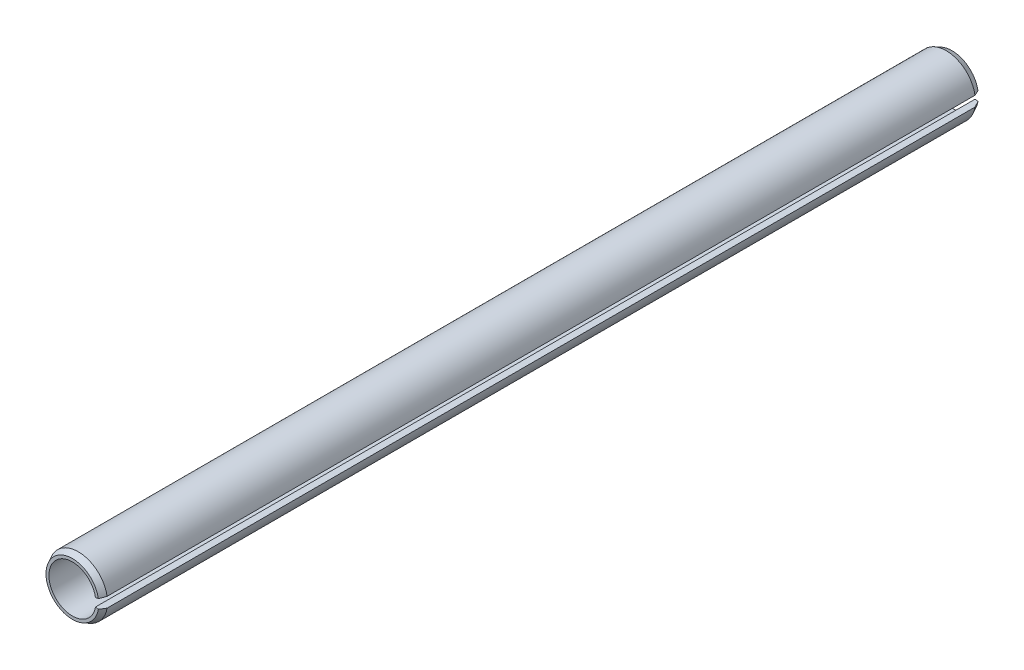
ISO-10303-21;
HEADER;
FILE_DESCRIPTION(('STEP AP214'),'2;1');
FILE_NAME('part.step','',(''),(''),'','','');
FILE_SCHEMA(('AUTOMOTIVE_DESIGN { 1 0 10303 214 1 1 1 1 }'));
ENDSEC;
DATA;
#1=APPLICATION_CONTEXT('core data for automotive mechanical design processes');
#2=APPLICATION_PROTOCOL_DEFINITION('international standard','automotive_design',2000,#1);
#3=PRODUCT_CONTEXT('',#1,'mechanical');
#4=PRODUCT('Part','Part','',(#3));
#5=PRODUCT_RELATED_PRODUCT_CATEGORY('part','',(#4));
#6=PRODUCT_DEFINITION_FORMATION('','',#4);
#7=PRODUCT_DEFINITION_CONTEXT('part definition',#1,'design');
#8=PRODUCT_DEFINITION('design','',#6,#7);
#9=PRODUCT_DEFINITION_SHAPE('','',#8);
#10=(LENGTH_UNIT() NAMED_UNIT(*) SI_UNIT(.MILLI.,.METRE.));
#11=(NAMED_UNIT(*) PLANE_ANGLE_UNIT() SI_UNIT($,.RADIAN.));
#12=(NAMED_UNIT(*) SI_UNIT($,.STERADIAN.) SOLID_ANGLE_UNIT());
#13=UNCERTAINTY_MEASURE_WITH_UNIT(LENGTH_MEASURE(1.E-05),#10,'distance_accuracy_value','');
#14=(GEOMETRIC_REPRESENTATION_CONTEXT(3) GLOBAL_UNCERTAINTY_ASSIGNED_CONTEXT((#13)) GLOBAL_UNIT_ASSIGNED_CONTEXT((#10,
#11,#12)) REPRESENTATION_CONTEXT('',''));
#15=CARTESIAN_POINT('',(0.,0.,0.));
#16=DIRECTION('',(0.,0.,1.));
#17=DIRECTION('',(1.,0.,0.));
#18=AXIS2_PLACEMENT_3D('',#15,#16,#17);
#19=CARTESIAN_POINT('',(0.,0.,-15.));
#20=DIRECTION('',(0.,0.,-1.));
#21=DIRECTION('',(-1.,0.,0.));
#22=AXIS2_PLACEMENT_3D('',#19,#20,#21);
#23=CYLINDRICAL_SURFACE('',#22,0.799999999999998);
#24=CARTESIAN_POINT('',(0.,0.,-15.));
#25=DIRECTION('',(0.,0.,-1.));
#26=DIRECTION('',(-1.,0.,0.));
#27=AXIS2_PLACEMENT_3D('',#24,#25,#26);
#28=CIRCLE('',#27,0.799999999999998);
#29=CARTESIAN_POINT('',(0.787846202409768,-0.138918542133538,-15.));
#30=VERTEX_POINT('',#29);
#31=CARTESIAN_POINT('',(0.787846202409768,0.138918542133539,-15.));
#32=VERTEX_POINT('',#31);
#33=EDGE_CURVE('E11',#30,#32,#28,.T.);
#34=ORIENTED_EDGE('',*,*,#33,.T.);
#35=DIRECTION('',(0.,0.,-1.));
#36=VECTOR('',#35,1.);
#37=CARTESIAN_POINT('',(0.787846202409768,0.138918542133539,15.));
#38=LINE('',#37,#36);
#39=CARTESIAN_POINT('',(0.787846202409768,0.138918542133539,15.));
#40=VERTEX_POINT('',#39);
#41=EDGE_CURVE('E84',#40,#32,#38,.T.);
#42=ORIENTED_EDGE('',*,*,#41,.F.);
#43=CARTESIAN_POINT('',(0.,0.,15.));
#44=DIRECTION('',(0.,0.,-1.));
#45=DIRECTION('',(-1.,0.,0.));
#46=AXIS2_PLACEMENT_3D('',#43,#44,#45);
#47=CIRCLE('',#46,0.799999999999998);
#48=CARTESIAN_POINT('',(0.787846202409768,-0.138918542133538,15.));
#49=VERTEX_POINT('',#48);
#50=EDGE_CURVE('E47',#49,#40,#47,.T.);
#51=ORIENTED_EDGE('',*,*,#50,.F.);
#52=DIRECTION('',(0.,0.,-1.));
#53=VECTOR('',#52,1.);
#54=CARTESIAN_POINT('',(0.787846202409768,-0.138918542133538,15.));
#55=LINE('',#54,#53);
#56=EDGE_CURVE('E86',#49,#30,#55,.T.);
#57=ORIENTED_EDGE('',*,*,#56,.T.);
#58=EDGE_LOOP('',(#34,#42,#51,#57));
#59=FACE_BOUND('',#58,.T.);
#60=ADVANCED_FACE('F32',(#59),#23,.F.);
#61=CARTESIAN_POINT('',(0.787846202409768,-0.138918542133538,-15.));
#62=DIRECTION('',(0.,0.,-1.));
#63=DIRECTION('',(-1.,0.,0.));
#64=AXIS2_PLACEMENT_3D('',#61,#62,#63);
#65=PLANE('',#64);
#66=CARTESIAN_POINT('',(0.,0.,-15.));
#67=DIRECTION('',(0.,0.,-1.));
#68=DIRECTION('',(-1.,0.,0.));
#69=AXIS2_PLACEMENT_3D('',#66,#67,#68);
#70=CIRCLE('',#69,0.899999999999998);
#71=CARTESIAN_POINT('',(0.886326977710989,-0.156283359900231,-15.));
#72=VERTEX_POINT('',#71);
#73=CARTESIAN_POINT('',(0.886326977710989,0.156283359900232,-15.));
#74=VERTEX_POINT('',#73);
#75=EDGE_CURVE('E40',#72,#74,#70,.T.);
#76=ORIENTED_EDGE('',*,*,#75,.T.);
#77=DIRECTION('',(0.984807753012209,0.173648177666924,0.));
#78=VECTOR('',#77,1.);
#79=CARTESIAN_POINT('',(0.787846202409768,0.138918542133539,-15.));
#80=LINE('',#79,#78);
#81=EDGE_CURVE('E95',#32,#74,#80,.T.);
#82=ORIENTED_EDGE('',*,*,#81,.F.);
#83=ORIENTED_EDGE('',*,*,#33,.F.);
#84=DIRECTION('',(0.984807753012209,-0.173648177666924,0.));
#85=VECTOR('',#84,1.);
#86=CARTESIAN_POINT('',(0.787846202409768,-0.138918542133538,-15.));
#87=LINE('',#86,#85);
#88=EDGE_CURVE('E111',#30,#72,#87,.T.);
#89=ORIENTED_EDGE('',*,*,#88,.T.);
#90=EDGE_LOOP('',(#76,#82,#83,#89));
#91=FACE_BOUND('',#90,.T.);
#92=ADVANCED_FACE('F34',(#91),#65,.T.);
#93=CARTESIAN_POINT('',(0.,0.,-15.));
#94=DIRECTION('',(0.,0.,1.));
#95=DIRECTION('',(1.,0.,0.));
#96=AXIS2_PLACEMENT_3D('',#93,#94,#95);
#97=CONICAL_SURFACE('',#96,0.899999999999998,0.463647609000805);
#98=CARTESIAN_POINT('',(0.,0.,-14.8));
#99=DIRECTION('',(0.,0.,-1.));
#100=DIRECTION('',(-1.,0.,0.));
#101=AXIS2_PLACEMENT_3D('',#98,#99,#100);
#102=CIRCLE('',#101,0.999999999999998);
#103=CARTESIAN_POINT('',(0.98480775301221,-0.173648177666923,-14.8));
#104=VERTEX_POINT('',#103);
#105=CARTESIAN_POINT('',(0.98480775301221,0.173648177666924,-14.8));
#106=VERTEX_POINT('',#105);
#107=EDGE_CURVE('E127',#104,#106,#102,.T.);
#108=ORIENTED_EDGE('',*,*,#107,.T.);
#109=DIRECTION('',(0.440419416100824,0.0776578258864405,0.894427190999916));
#110=VECTOR('',#109,1.);
#111=CARTESIAN_POINT('',(0.886326977710989,0.156283359900232,-15.));
#112=LINE('',#111,#110);
#113=EDGE_CURVE('E100',#74,#106,#112,.T.);
#114=ORIENTED_EDGE('',*,*,#113,.F.);
#115=ORIENTED_EDGE('',*,*,#75,.F.);
#116=DIRECTION('',(0.440419416100824,-0.0776578258864405,0.894427190999916));
#117=VECTOR('',#116,1.);
#118=CARTESIAN_POINT('',(0.886326977710989,-0.156283359900231,-15.));
#119=LINE('',#118,#117);
#120=EDGE_CURVE('E113',#72,#104,#119,.T.);
#121=ORIENTED_EDGE('',*,*,#120,.T.);
#122=EDGE_LOOP('',(#108,#114,#115,#121));
#123=FACE_BOUND('',#122,.T.);
#124=ADVANCED_FACE('F129',(#123),#97,.T.);
#125=CARTESIAN_POINT('',(0.,0.,-15.));
#126=DIRECTION('',(0.,0.,-1.));
#127=DIRECTION('',(-1.,0.,0.));
#128=AXIS2_PLACEMENT_3D('',#125,#126,#127);
#129=CYLINDRICAL_SURFACE('',#128,0.999999999999998);
#130=CARTESIAN_POINT('',(0.,0.,14.8));
#131=DIRECTION('',(0.,0.,-1.));
#132=DIRECTION('',(-1.,0.,0.));
#133=AXIS2_PLACEMENT_3D('',#130,#131,#132);
#134=CIRCLE('',#133,0.999999999999998);
#135=CARTESIAN_POINT('',(0.98480775301221,-0.173648177666923,14.8));
#136=VERTEX_POINT('',#135);
#137=CARTESIAN_POINT('',(0.98480775301221,0.173648177666924,14.8));
#138=VERTEX_POINT('',#137);
#139=EDGE_CURVE('E125',#136,#138,#134,.T.);
#140=ORIENTED_EDGE('',*,*,#139,.T.);
#141=DIRECTION('',(0.,0.,1.));
#142=VECTOR('',#141,1.);
#143=CARTESIAN_POINT('',(0.98480775301221,0.173648177666924,-14.8));
#144=LINE('',#143,#142);
#145=EDGE_CURVE('E102',#106,#138,#144,.T.);
#146=ORIENTED_EDGE('',*,*,#145,.F.);
#147=ORIENTED_EDGE('',*,*,#107,.F.);
#148=DIRECTION('',(0.,0.,1.));
#149=VECTOR('',#148,1.);
#150=CARTESIAN_POINT('',(0.98480775301221,-0.173648177666923,-14.8));
#151=LINE('',#150,#149);
#152=EDGE_CURVE('E116',#104,#136,#151,.T.);
#153=ORIENTED_EDGE('',*,*,#152,.T.);
#154=EDGE_LOOP('',(#140,#146,#147,#153));
#155=FACE_BOUND('',#154,.T.);
#156=ADVANCED_FACE('F135',(#155),#129,.T.);
#157=CARTESIAN_POINT('',(0.,0.,14.8));
#158=DIRECTION('',(0.,0.,-1.));
#159=DIRECTION('',(-1.,0.,0.));
#160=AXIS2_PLACEMENT_3D('',#157,#158,#159);
#161=CONICAL_SURFACE('',#160,0.999999999999998,0.463647609000808);
#162=CARTESIAN_POINT('',(0.,0.,15.));
#163=DIRECTION('',(0.,0.,-1.));
#164=DIRECTION('',(-1.,0.,0.));
#165=AXIS2_PLACEMENT_3D('',#162,#163,#164);
#166=CIRCLE('',#165,0.899999999999998);
#167=CARTESIAN_POINT('',(0.886326977710989,-0.156283359900231,15.));
#168=VERTEX_POINT('',#167);
#169=CARTESIAN_POINT('',(0.886326977710989,0.156283359900232,15.));
#170=VERTEX_POINT('',#169);
#171=EDGE_CURVE('E55',#168,#170,#166,.T.);
#172=ORIENTED_EDGE('',*,*,#171,.T.);
#173=DIRECTION('',(-0.440419416100824,-0.0776578258864405,0.894427190999916));
#174=VECTOR('',#173,1.);
#175=CARTESIAN_POINT('',(0.886326977710989,0.156283359900232,15.));
#176=LINE('',#175,#174);
#177=EDGE_CURVE('E107',#138,#170,#176,.T.);
#178=ORIENTED_EDGE('',*,*,#177,.F.);
#179=ORIENTED_EDGE('',*,*,#139,.F.);
#180=DIRECTION('',(-0.440419416100824,0.0776578258864405,0.894427190999916));
#181=VECTOR('',#180,1.);
#182=CARTESIAN_POINT('',(0.886326977710989,-0.156283359900231,15.));
#183=LINE('',#182,#181);
#184=EDGE_CURVE('E119',#136,#168,#183,.T.);
#185=ORIENTED_EDGE('',*,*,#184,.T.);
#186=EDGE_LOOP('',(#172,#178,#179,#185));
#187=FACE_BOUND('',#186,.T.);
#188=ADVANCED_FACE('F138',(#187),#161,.T.);
#189=CARTESIAN_POINT('',(0.787846202409768,-0.138918542133538,15.));
#190=DIRECTION('',(0.,0.,1.));
#191=DIRECTION('',(1.,0.,0.));
#192=AXIS2_PLACEMENT_3D('',#189,#190,#191);
#193=PLANE('',#192);
#194=DIRECTION('',(-0.984807753012209,0.173648177666924,0.));
#195=VECTOR('',#194,1.);
#196=CARTESIAN_POINT('',(0.787846202409768,-0.138918542133538,15.));
#197=LINE('',#196,#195);
#198=EDGE_CURVE('E121',#168,#49,#197,.T.);
#199=ORIENTED_EDGE('',*,*,#198,.T.);
#200=ORIENTED_EDGE('',*,*,#50,.T.);
#201=DIRECTION('',(-0.984807753012209,-0.173648177666924,0.));
#202=VECTOR('',#201,1.);
#203=CARTESIAN_POINT('',(0.787846202409768,0.138918542133539,15.));
#204=LINE('',#203,#202);
#205=EDGE_CURVE('E98',#170,#40,#204,.T.);
#206=ORIENTED_EDGE('',*,*,#205,.F.);
#207=ORIENTED_EDGE('',*,*,#171,.F.);
#208=EDGE_LOOP('',(#199,#200,#206,#207));
#209=FACE_BOUND('',#208,.T.);
#210=ADVANCED_FACE('F140',(#209),#193,.T.);
#211=CARTESIAN_POINT('',(0.,0.,0.));
#212=DIRECTION('',(-0.173648177666924,-0.984807753012209,0.));
#213=DIRECTION('',(0.,0.,1.));
#214=AXIS2_PLACEMENT_3D('',#211,#212,#213);
#215=PLANE('',#214);
#216=ORIENTED_EDGE('',*,*,#56,.F.);
#217=ORIENTED_EDGE('',*,*,#198,.F.);
#218=ORIENTED_EDGE('',*,*,#184,.F.);
#219=ORIENTED_EDGE('',*,*,#152,.F.);
#220=ORIENTED_EDGE('',*,*,#120,.F.);
#221=ORIENTED_EDGE('',*,*,#88,.F.);
#222=EDGE_LOOP('',(#216,#217,#218,#219,#220,#221));
#223=FACE_BOUND('',#222,.T.);
#224=ADVANCED_FACE('F142',(#223),#215,.F.);
#225=CARTESIAN_POINT('',(0.,0.,0.));
#226=DIRECTION('',(0.173648177666924,-0.984807753012209,0.));
#227=DIRECTION('',(0.,0.,1.));
#228=AXIS2_PLACEMENT_3D('',#225,#226,#227);
#229=PLANE('',#228);
#230=ORIENTED_EDGE('',*,*,#41,.T.);
#231=ORIENTED_EDGE('',*,*,#81,.T.);
#232=ORIENTED_EDGE('',*,*,#113,.T.);
#233=ORIENTED_EDGE('',*,*,#145,.T.);
#234=ORIENTED_EDGE('',*,*,#177,.T.);
#235=ORIENTED_EDGE('',*,*,#205,.T.);
#236=EDGE_LOOP('',(#230,#231,#232,#233,#234,#235));
#237=FACE_BOUND('',#236,.T.);
#238=ADVANCED_FACE('F93',(#237),#229,.T.);
#239=CLOSED_SHELL('',(#60,#92,#124,#156,#188,#210,#224,#238));
#240=MANIFOLD_SOLID_BREP('B2',#239);
#241=ADVANCED_BREP_SHAPE_REPRESENTATION('',(#18,#240),#14);
#242=SHAPE_DEFINITION_REPRESENTATION(#9,#241);
ENDSEC;
END-ISO-10303-21;
